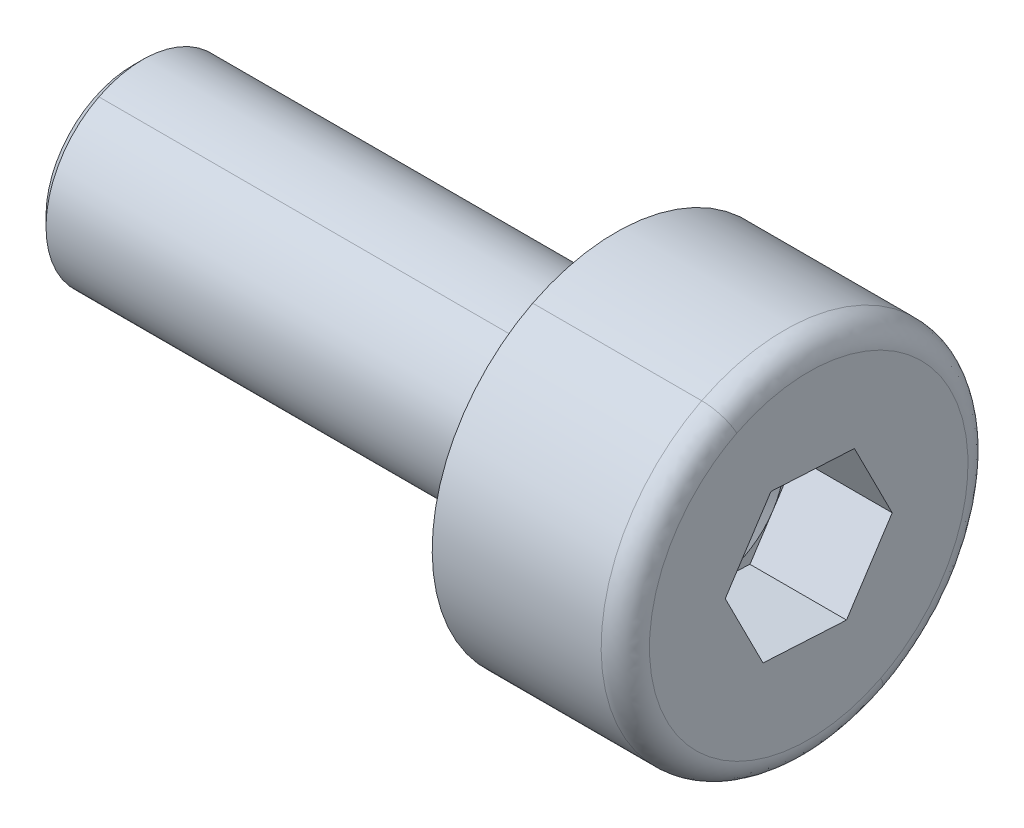
ISO-10303-21;
HEADER;
FILE_DESCRIPTION(('STEP AP214'),'2;1');
FILE_NAME('part.step','',(''),(''),'','','');
FILE_SCHEMA(('AUTOMOTIVE_DESIGN { 1 0 10303 214 1 1 1 1 }'));
ENDSEC;
DATA;
#1=APPLICATION_CONTEXT('core data for automotive mechanical design processes');
#2=APPLICATION_PROTOCOL_DEFINITION('international standard','automotive_design',2000,#1);
#3=PRODUCT_CONTEXT('',#1,'mechanical');
#4=PRODUCT('Part','Part','',(#3));
#5=PRODUCT_RELATED_PRODUCT_CATEGORY('part','',(#4));
#6=PRODUCT_DEFINITION_FORMATION('','',#4);
#7=PRODUCT_DEFINITION_CONTEXT('part definition',#1,'design');
#8=PRODUCT_DEFINITION('design','',#6,#7);
#9=PRODUCT_DEFINITION_SHAPE('','',#8);
#10=(LENGTH_UNIT() NAMED_UNIT(*) SI_UNIT(.MILLI.,.METRE.));
#11=(NAMED_UNIT(*) PLANE_ANGLE_UNIT() SI_UNIT($,.RADIAN.));
#12=(NAMED_UNIT(*) SI_UNIT($,.STERADIAN.) SOLID_ANGLE_UNIT());
#13=UNCERTAINTY_MEASURE_WITH_UNIT(LENGTH_MEASURE(1.E-05),#10,'distance_accuracy_value','');
#14=(GEOMETRIC_REPRESENTATION_CONTEXT(3) GLOBAL_UNCERTAINTY_ASSIGNED_CONTEXT((#13)) GLOBAL_UNIT_ASSIGNED_CONTEXT((#10,
#11,#12)) REPRESENTATION_CONTEXT('',''));
#15=CARTESIAN_POINT('',(0.,0.,0.));
#16=DIRECTION('',(0.,0.,1.));
#17=DIRECTION('',(1.,0.,0.));
#18=AXIS2_PLACEMENT_3D('',#15,#16,#17);
#19=CARTESIAN_POINT('',(31.89999999991,0.,-17.));
#20=DIRECTION('',(1.,0.,0.));
#21=DIRECTION('',(0.,-0.892037641551602,-0.451961111219821));
#22=AXIS2_PLACEMENT_3D('',#19,#20,#21);
#23=CONICAL_SURFACE('',#22,0.749999999698048,1.04719755078461);
#24=DIRECTION('',(0.500000000356795,0.77252725853189,0.391409803745906));
#25=VECTOR('',#24,1.);
#26=CARTESIAN_POINT('',(31.89999999991,0.669028230894353,-16.6610291667216));
#27=LINE('',#26,#25);
#28=CARTESIAN_POINT('',(31.4669872980623,-3.0423578403047E-10,-17.0000000001542));
#29=VERTEX_POINT('',#28);
#30=CARTESIAN_POINT('',(31.9000000000412,0.669028231097183,-16.6610291666189));
#31=VERTEX_POINT('',#30);
#32=EDGE_CURVE('E253',#29,#31,#27,.T.);
#33=ORIENTED_EDGE('',*,*,#32,.F.);
#34=DIRECTION('',(0.500000000356795,-0.77252725853189,-0.391409803745906));
#35=VECTOR('',#34,1.);
#36=CARTESIAN_POINT('',(31.89999999991,-0.669028230894347,-17.3389708332784));
#37=LINE('',#36,#35);
#38=CARTESIAN_POINT('',(31.9000000000412,-0.669028231097177,-17.3389708333812));
#39=VERTEX_POINT('',#38);
#40=EDGE_CURVE('E183',#29,#39,#37,.T.);
#41=ORIENTED_EDGE('',*,*,#40,.T.);
#42=CARTESIAN_POINT('',(31.9000000000412,0.,-17.));
#43=DIRECTION('',(-1.,0.,0.));
#44=DIRECTION('',(0.,-0.892037641551594,-0.451961111219836));
#45=AXIS2_PLACEMENT_3D('',#42,#43,#44);
#46=CIRCLE('',#45,0.749999999925421);
#47=CARTESIAN_POINT('',(31.9000000000206,-0.409910027308919,-17.6280714684299));
#48=VERTEX_POINT('',#47);
#49=EDGE_CURVE('E11',#48,#39,#46,.T.);
#50=ORIENTED_EDGE('',*,*,#49,.F.);
#51=CARTESIAN_POINT('',(31.9000000000412,0.,-17.));
#52=DIRECTION('',(-1.,0.,0.));
#53=DIRECTION('',(0.,-0.892037641551611,-0.451961111219804));
#54=AXIS2_PLACEMENT_3D('',#51,#52,#53);
#55=CIRCLE('',#54,0.749999999925421);
#56=CARTESIAN_POINT('',(31.9000000000206,0.338970833398014,-17.6690282311305));
#57=VERTEX_POINT('',#56);
#58=EDGE_CURVE('E27',#57,#48,#55,.T.);
#59=ORIENTED_EDGE('',*,*,#58,.F.);
#60=CARTESIAN_POINT('',(31.9000000000412,0.,-17.));
#61=DIRECTION('',(-1.,0.,0.));
#62=DIRECTION('',(0.,-0.892037641551602,-0.451961111219822));
#63=AXIS2_PLACEMENT_3D('',#60,#61,#62);
#64=CIRCLE('',#63,0.749999999925422);
#65=CARTESIAN_POINT('',(31.9000000000206,0.748880860706936,-17.0409567627006));
#66=VERTEX_POINT('',#65);
#67=EDGE_CURVE('E239',#66,#57,#64,.T.);
#68=ORIENTED_EDGE('',*,*,#67,.F.);
#69=CARTESIAN_POINT('',(31.9000000000412,0.,-17.));
#70=DIRECTION('',(-1.,0.,0.));
#71=DIRECTION('',(0.,-0.892037641551597,-0.451961111219831));
#72=AXIS2_PLACEMENT_3D('',#69,#70,#71);
#73=CIRCLE('',#72,0.749999999925422);
#74=EDGE_CURVE('E236',#31,#66,#73,.T.);
#75=ORIENTED_EDGE('',*,*,#74,.F.);
#76=EDGE_LOOP('',(#33,#41,#50,#59,#68,#75));
#77=FACE_BOUND('',#76,.T.);
#78=ADVANCED_FACE('F16',(#77),#23,.F.);
#79=CARTESIAN_POINT('',(31.9,-0.677941666829725,-15.6619435376726));
#80=DIRECTION('',(1.,0.,0.));
#81=DIRECTION('',(0.,1.,0.));
#82=AXIS2_PLACEMENT_3D('',#79,#80,#81);
#83=PLANE('',#82);
#84=CARTESIAN_POINT('',(31.9000000000412,0.,-17.));
#85=DIRECTION('',(-1.,0.,0.));
#86=DIRECTION('',(0.,-0.892037641551604,-0.451961111219818));
#87=AXIS2_PLACEMENT_3D('',#84,#85,#86);
#88=CIRCLE('',#87,0.749999999925421);
#89=CARTESIAN_POINT('',(31.9000000000206,-0.74888086070693,-16.9590432372995));
#90=VERTEX_POINT('',#89);
#91=CARTESIAN_POINT('',(31.9000000000206,-0.338970833398008,-16.3309717688696));
#92=VERTEX_POINT('',#91);
#93=EDGE_CURVE('E219',#90,#92,#88,.T.);
#94=ORIENTED_EDGE('',*,*,#93,.T.);
#95=DIRECTION('',(0.,0.892037641551603,0.451961111219819));
#96=VECTOR('',#95,1.);
#97=CARTESIAN_POINT('',(31.9,-0.725234462772684,-16.5266766707558));
#98=LINE('',#97,#96);
#99=CARTESIAN_POINT('',(31.9,-0.725234462772684,-16.5266766707558));
#100=VERTEX_POINT('',#99);
#101=EDGE_CURVE('E42',#100,#92,#98,.T.);
#102=ORIENTED_EDGE('',*,*,#101,.F.);
#103=DIRECTION('',(0.,0.0546090169367945,0.998507814325555));
#104=VECTOR('',#103,1.);
#105=CARTESIAN_POINT('',(31.9,-0.772527258715643,-17.391409803839));
#106=LINE('',#105,#104);
#107=EDGE_CURVE('E195',#90,#100,#106,.T.);
#108=ORIENTED_EDGE('',*,*,#107,.F.);
#109=EDGE_LOOP('',(#94,#102,#108));
#110=FACE_BOUND('',#109,.T.);
#111=ADVANCED_FACE('F364',(#110),#83,.T.);
#112=CARTESIAN_POINT('',(31.9,-0.677941666829725,-15.6619435376726));
#113=DIRECTION('',(1.,0.,0.));
#114=DIRECTION('',(0.,1.,0.));
#115=AXIS2_PLACEMENT_3D('',#112,#113,#114);
#116=PLANE('',#115);
#117=ORIENTED_EDGE('',*,*,#49,.T.);
#118=CARTESIAN_POINT('',(31.9000000000412,0.,-17.));
#119=DIRECTION('',(-1.,0.,0.));
#120=DIRECTION('',(0.,-0.892037641551602,-0.451961111219822));
#121=AXIS2_PLACEMENT_3D('',#118,#119,#120);
#122=CIRCLE('',#121,0.749999999925422);
#123=EDGE_CURVE('E313',#39,#90,#122,.T.);
#124=ORIENTED_EDGE('',*,*,#123,.T.);
#125=DIRECTION('',(0.,0.0546090169367945,0.998507814325555));
#126=VECTOR('',#125,1.);
#127=CARTESIAN_POINT('',(31.9,-0.772527258715643,-17.391409803839));
#128=LINE('',#127,#126);
#129=CARTESIAN_POINT('',(31.9,-0.772527258715643,-17.391409803839));
#130=VERTEX_POINT('',#129);
#131=EDGE_CURVE('E214',#130,#90,#128,.T.);
#132=ORIENTED_EDGE('',*,*,#131,.F.);
#133=DIRECTION('',(0.,-0.837428624614809,0.546546703105736));
#134=VECTOR('',#133,1.);
#135=CARTESIAN_POINT('',(31.9,-0.0472927959429555,-17.8647331330832));
#136=LINE('',#135,#134);
#137=EDGE_CURVE('E210',#48,#130,#136,.T.);
#138=ORIENTED_EDGE('',*,*,#137,.F.);
#139=EDGE_LOOP('',(#117,#124,#132,#138));
#140=FACE_BOUND('',#139,.T.);
#141=ADVANCED_FACE('F18',(#140),#116,.T.);
#142=CARTESIAN_POINT('',(31.9,-0.677941666829725,-15.6619435376726));
#143=DIRECTION('',(1.,0.,0.));
#144=DIRECTION('',(0.,1.,0.));
#145=AXIS2_PLACEMENT_3D('',#142,#143,#144);
#146=PLANE('',#145);
#147=ORIENTED_EDGE('',*,*,#58,.T.);
#148=DIRECTION('',(0.,-0.837428624614809,0.546546703105736));
#149=VECTOR('',#148,1.);
#150=CARTESIAN_POINT('',(31.9,-0.0472927959429555,-17.8647331330832));
#151=LINE('',#150,#149);
#152=CARTESIAN_POINT('',(31.9,-0.0472927959429555,-17.8647331330832));
#153=VERTEX_POINT('',#152);
#154=EDGE_CURVE('E200',#153,#48,#151,.T.);
#155=ORIENTED_EDGE('',*,*,#154,.F.);
#156=DIRECTION('',(0.,-0.892037641551603,-0.451961111219819));
#157=VECTOR('',#156,1.);
#158=CARTESIAN_POINT('',(31.9,0.72523446277269,-17.4733233292442));
#159=LINE('',#158,#157);
#160=EDGE_CURVE('E297',#57,#153,#159,.T.);
#161=ORIENTED_EDGE('',*,*,#160,.F.);
#162=EDGE_LOOP('',(#147,#155,#161));
#163=FACE_BOUND('',#162,.T.);
#164=ADVANCED_FACE('F452',(#163),#146,.T.);
#165=CARTESIAN_POINT('',(31.9,-0.677941666829725,-15.6619435376726));
#166=DIRECTION('',(1.,0.,0.));
#167=DIRECTION('',(0.,1.,0.));
#168=AXIS2_PLACEMENT_3D('',#165,#166,#167);
#169=PLANE('',#168);
#170=ORIENTED_EDGE('',*,*,#67,.T.);
#171=DIRECTION('',(0.,-0.892037641551603,-0.451961111219819));
#172=VECTOR('',#171,1.);
#173=CARTESIAN_POINT('',(31.9,0.72523446277269,-17.4733233292442));
#174=LINE('',#173,#172);
#175=CARTESIAN_POINT('',(31.9,0.72523446277269,-17.4733233292442));
#176=VERTEX_POINT('',#175);
#177=EDGE_CURVE('E235',#176,#57,#174,.T.);
#178=ORIENTED_EDGE('',*,*,#177,.F.);
#179=DIRECTION('',(0.,-0.0546090169367943,-0.998507814325555));
#180=VECTOR('',#179,1.);
#181=CARTESIAN_POINT('',(31.9,0.772527258715648,-16.608590196161));
#182=LINE('',#181,#180);
#183=EDGE_CURVE('E221',#66,#176,#182,.T.);
#184=ORIENTED_EDGE('',*,*,#183,.F.);
#185=EDGE_LOOP('',(#170,#178,#184));
#186=FACE_BOUND('',#185,.T.);
#187=ADVANCED_FACE('F429',(#186),#169,.T.);
#188=CARTESIAN_POINT('',(31.9,-0.677941666829725,-15.6619435376726));
#189=DIRECTION('',(1.,0.,0.));
#190=DIRECTION('',(0.,1.,0.));
#191=AXIS2_PLACEMENT_3D('',#188,#189,#190);
#192=PLANE('',#191);
#193=CARTESIAN_POINT('',(31.9000000000412,0.,-17.));
#194=DIRECTION('',(-1.,0.,0.));
#195=DIRECTION('',(0.,-0.892037641551606,-0.451961111219813));
#196=AXIS2_PLACEMENT_3D('',#193,#194,#195);
#197=CIRCLE('',#196,0.749999999925421);
#198=CARTESIAN_POINT('',(31.9000000000206,0.409910027308925,-16.3719285315701));
#199=VERTEX_POINT('',#198);
#200=EDGE_CURVE('E215',#92,#199,#197,.T.);
#201=ORIENTED_EDGE('',*,*,#200,.T.);
#202=DIRECTION('',(0.,0.837428624614809,-0.546546703105736));
#203=VECTOR('',#202,1.);
#204=CARTESIAN_POINT('',(31.9,0.0472927959429621,-16.1352668669168));
#205=LINE('',#204,#203);
#206=CARTESIAN_POINT('',(31.9,0.0472927959429621,-16.1352668669168));
#207=VERTEX_POINT('',#206);
#208=EDGE_CURVE('E226',#207,#199,#205,.T.);
#209=ORIENTED_EDGE('',*,*,#208,.F.);
#210=DIRECTION('',(0.,0.892037641551603,0.451961111219819));
#211=VECTOR('',#210,1.);
#212=CARTESIAN_POINT('',(31.9,-0.725234462772684,-16.5266766707558));
#213=LINE('',#212,#211);
#214=EDGE_CURVE('E211',#92,#207,#213,.T.);
#215=ORIENTED_EDGE('',*,*,#214,.F.);
#216=EDGE_LOOP('',(#201,#209,#215));
#217=FACE_BOUND('',#216,.T.);
#218=ADVANCED_FACE('F373',(#217),#192,.T.);
#219=CARTESIAN_POINT('',(31.9,-0.677941666829725,-15.6619435376726));
#220=DIRECTION('',(1.,0.,0.));
#221=DIRECTION('',(0.,1.,0.));
#222=AXIS2_PLACEMENT_3D('',#219,#220,#221);
#223=PLANE('',#222);
#224=CARTESIAN_POINT('',(31.9000000000412,0.,-17.));
#225=DIRECTION('',(-1.,0.,0.));
#226=DIRECTION('',(0.,-0.892037641551599,-0.451961111219827));
#227=AXIS2_PLACEMENT_3D('',#224,#225,#226);
#228=CIRCLE('',#227,0.749999999925422);
#229=EDGE_CURVE('E220',#199,#31,#228,.T.);
#230=ORIENTED_EDGE('',*,*,#229,.T.);
#231=ORIENTED_EDGE('',*,*,#74,.T.);
#232=DIRECTION('',(0.,-0.0546090169367943,-0.998507814325555));
#233=VECTOR('',#232,1.);
#234=CARTESIAN_POINT('',(31.9,0.772527258715648,-16.608590196161));
#235=LINE('',#234,#233);
#236=CARTESIAN_POINT('',(31.9,0.772527258715648,-16.608590196161));
#237=VERTEX_POINT('',#236);
#238=EDGE_CURVE('E293',#237,#66,#235,.T.);
#239=ORIENTED_EDGE('',*,*,#238,.F.);
#240=DIRECTION('',(0.,0.837428624614809,-0.546546703105736));
#241=VECTOR('',#240,1.);
#242=CARTESIAN_POINT('',(31.9,0.0472927959429621,-16.1352668669168));
#243=LINE('',#242,#241);
#244=EDGE_CURVE('E179',#199,#237,#243,.T.);
#245=ORIENTED_EDGE('',*,*,#244,.F.);
#246=EDGE_LOOP('',(#230,#231,#239,#245));
#247=FACE_BOUND('',#246,.T.);
#248=ADVANCED_FACE('F440',(#247),#223,.T.);
#249=CARTESIAN_POINT('',(31.9,-0.725234462772684,-16.5266766707558));
#250=DIRECTION('',(0.,0.451961111219819,-0.892037641551603));
#251=DIRECTION('',(-1.,0.,0.));
#252=AXIS2_PLACEMENT_3D('',#249,#250,#251);
#253=PLANE('',#252);
#254=ORIENTED_EDGE('',*,*,#214,.T.);
#255=DIRECTION('',(-1.,0.,0.));
#256=VECTOR('',#255,1.);
#257=CARTESIAN_POINT('',(31.9,0.0472927959429621,-16.1352668669168));
#258=LINE('',#257,#256);
#259=CARTESIAN_POINT('',(32.9,0.0472927959429621,-16.1352668669168));
#260=VERTEX_POINT('',#259);
#261=EDGE_CURVE('E178',#260,#207,#258,.T.);
#262=ORIENTED_EDGE('',*,*,#261,.F.);
#263=DIRECTION('',(0.,-0.892037641551603,-0.451961111219819));
#264=VECTOR('',#263,1.);
#265=CARTESIAN_POINT('',(32.9,-0.338970833414861,-16.3309717688363));
#266=LINE('',#265,#264);
#267=CARTESIAN_POINT('',(32.9,-0.725234462772684,-16.5266766707558));
#268=VERTEX_POINT('',#267);
#269=EDGE_CURVE('E189',#260,#268,#266,.T.);
#270=ORIENTED_EDGE('',*,*,#269,.T.);
#271=DIRECTION('',(1.,0.,0.));
#272=VECTOR('',#271,1.);
#273=CARTESIAN_POINT('',(31.9,-0.725234462772684,-16.5266766707558));
#274=LINE('',#273,#272);
#275=EDGE_CURVE('E199',#100,#268,#274,.T.);
#276=ORIENTED_EDGE('',*,*,#275,.F.);
#277=ORIENTED_EDGE('',*,*,#101,.T.);
#278=EDGE_LOOP('',(#254,#262,#270,#276,#277));
#279=FACE_BOUND('',#278,.T.);
#280=ADVANCED_FACE('F376',(#279),#253,.T.);
#281=CARTESIAN_POINT('',(31.9,-0.772527258715643,-17.391409803839));
#282=DIRECTION('',(0.,0.998507814325555,-0.0546090169367945));
#283=DIRECTION('',(-1.,0.,0.));
#284=AXIS2_PLACEMENT_3D('',#281,#282,#283);
#285=PLANE('',#284);
#286=ORIENTED_EDGE('',*,*,#107,.T.);
#287=ORIENTED_EDGE('',*,*,#275,.T.);
#288=DIRECTION('',(0.,-0.0546090169367944,-0.998507814325555));
#289=VECTOR('',#288,1.);
#290=CARTESIAN_POINT('',(32.9,-0.725234462772684,-16.5266766707558));
#291=LINE('',#290,#289);
#292=CARTESIAN_POINT('',(32.9,-0.772527258715643,-17.391409803839));
#293=VERTEX_POINT('',#292);
#294=EDGE_CURVE('E194',#268,#293,#291,.T.);
#295=ORIENTED_EDGE('',*,*,#294,.T.);
#296=DIRECTION('',(1.,0.,0.));
#297=VECTOR('',#296,1.);
#298=CARTESIAN_POINT('',(31.9,-0.772527258715643,-17.391409803839));
#299=LINE('',#298,#297);
#300=EDGE_CURVE('E207',#130,#293,#299,.T.);
#301=ORIENTED_EDGE('',*,*,#300,.F.);
#302=ORIENTED_EDGE('',*,*,#131,.T.);
#303=EDGE_LOOP('',(#286,#287,#295,#301,#302));
#304=FACE_BOUND('',#303,.T.);
#305=ADVANCED_FACE('F380',(#304),#285,.T.);
#306=CARTESIAN_POINT('',(31.9,-0.0472927959429555,-17.8647331330832));
#307=DIRECTION('',(0.,0.546546703105736,0.837428624614809));
#308=DIRECTION('',(1.,0.,0.));
#309=AXIS2_PLACEMENT_3D('',#306,#307,#308);
#310=PLANE('',#309);
#311=ORIENTED_EDGE('',*,*,#137,.T.);
#312=ORIENTED_EDGE('',*,*,#300,.T.);
#313=DIRECTION('',(0.,0.837428624614809,-0.546546703105735));
#314=VECTOR('',#313,1.);
#315=CARTESIAN_POINT('',(32.9,-0.772527258715643,-17.391409803839));
#316=LINE('',#315,#314);
#317=CARTESIAN_POINT('',(32.9,-0.0472927959429555,-17.8647331330832));
#318=VERTEX_POINT('',#317);
#319=EDGE_CURVE('E320',#293,#318,#316,.T.);
#320=ORIENTED_EDGE('',*,*,#319,.T.);
#321=DIRECTION('',(1.,0.,0.));
#322=VECTOR('',#321,1.);
#323=CARTESIAN_POINT('',(31.9,-0.0472927959429555,-17.8647331330832));
#324=LINE('',#323,#322);
#325=EDGE_CURVE('E301',#153,#318,#324,.T.);
#326=ORIENTED_EDGE('',*,*,#325,.F.);
#327=ORIENTED_EDGE('',*,*,#154,.T.);
#328=EDGE_LOOP('',(#311,#312,#320,#326,#327));
#329=FACE_BOUND('',#328,.T.);
#330=ADVANCED_FACE('F450',(#329),#310,.T.);
#331=CARTESIAN_POINT('',(31.9,0.72523446277269,-17.4733233292442));
#332=DIRECTION('',(0.,-0.451961111219819,0.892037641551603));
#333=DIRECTION('',(-1.,0.,0.));
#334=AXIS2_PLACEMENT_3D('',#331,#332,#333);
#335=PLANE('',#334);
#336=ORIENTED_EDGE('',*,*,#160,.T.);
#337=ORIENTED_EDGE('',*,*,#325,.T.);
#338=DIRECTION('',(0.,0.892037641551603,0.451961111219819));
#339=VECTOR('',#338,1.);
#340=CARTESIAN_POINT('',(32.9,0.338970833414868,-17.6690282311637));
#341=LINE('',#340,#339);
#342=CARTESIAN_POINT('',(32.9,0.72523446277269,-17.4733233292442));
#343=VERTEX_POINT('',#342);
#344=EDGE_CURVE('E205',#318,#343,#341,.T.);
#345=ORIENTED_EDGE('',*,*,#344,.T.);
#346=DIRECTION('',(1.,0.,0.));
#347=VECTOR('',#346,1.);
#348=CARTESIAN_POINT('',(31.9,0.72523446277269,-17.4733233292442));
#349=LINE('',#348,#347);
#350=EDGE_CURVE('E225',#176,#343,#349,.T.);
#351=ORIENTED_EDGE('',*,*,#350,.F.);
#352=ORIENTED_EDGE('',*,*,#177,.T.);
#353=EDGE_LOOP('',(#336,#337,#345,#351,#352));
#354=FACE_BOUND('',#353,.T.);
#355=ADVANCED_FACE('F432',(#354),#335,.T.);
#356=CARTESIAN_POINT('',(31.9,0.772527258715648,-16.608590196161));
#357=DIRECTION('',(0.,-0.998507814325555,0.0546090169367943));
#358=DIRECTION('',(-1.,0.,0.));
#359=AXIS2_PLACEMENT_3D('',#356,#357,#358);
#360=PLANE('',#359);
#361=ORIENTED_EDGE('',*,*,#183,.T.);
#362=ORIENTED_EDGE('',*,*,#350,.T.);
#363=DIRECTION('',(0.,0.0546090169367943,0.998507814325555));
#364=VECTOR('',#363,1.);
#365=CARTESIAN_POINT('',(32.9,0.72523446277269,-17.4733233292442));
#366=LINE('',#365,#364);
#367=CARTESIAN_POINT('',(32.9,0.772527258715648,-16.608590196161));
#368=VERTEX_POINT('',#367);
#369=EDGE_CURVE('E201',#343,#368,#366,.T.);
#370=ORIENTED_EDGE('',*,*,#369,.T.);
#371=DIRECTION('',(1.,0.,0.));
#372=VECTOR('',#371,1.);
#373=CARTESIAN_POINT('',(31.9,0.772527258715648,-16.608590196161));
#374=LINE('',#373,#372);
#375=EDGE_CURVE('E174',#237,#368,#374,.T.);
#376=ORIENTED_EDGE('',*,*,#375,.F.);
#377=ORIENTED_EDGE('',*,*,#238,.T.);
#378=EDGE_LOOP('',(#361,#362,#370,#376,#377));
#379=FACE_BOUND('',#378,.T.);
#380=ADVANCED_FACE('F436',(#379),#360,.T.);
#381=CARTESIAN_POINT('',(31.9,0.0472927959429621,-16.1352668669168));
#382=DIRECTION('',(0.,-0.546546703105736,-0.837428624614809));
#383=DIRECTION('',(0.,-0.837428624614809,0.546546703105736));
#384=AXIS2_PLACEMENT_3D('',#381,#382,#383);
#385=PLANE('',#384);
#386=ORIENTED_EDGE('',*,*,#244,.T.);
#387=ORIENTED_EDGE('',*,*,#375,.T.);
#388=DIRECTION('',(0.,-0.837428624614809,0.546546703105736));
#389=VECTOR('',#388,1.);
#390=CARTESIAN_POINT('',(32.9,0.772527258715648,-16.608590196161));
#391=LINE('',#390,#389);
#392=EDGE_CURVE('E193',#368,#260,#391,.T.);
#393=ORIENTED_EDGE('',*,*,#392,.T.);
#394=ORIENTED_EDGE('',*,*,#261,.T.);
#395=ORIENTED_EDGE('',*,*,#208,.T.);
#396=EDGE_LOOP('',(#386,#387,#393,#394,#395));
#397=FACE_BOUND('',#396,.T.);
#398=ADVANCED_FACE('F442',(#397),#385,.T.);
#399=CARTESIAN_POINT('',(32.9,0.,-17.));
#400=DIRECTION('',(-1.,0.,0.));
#401=DIRECTION('',(0.,0.,1.));
#402=AXIS2_PLACEMENT_3D('',#399,#400,#401);
#403=PLANE('',#402);
#404=ORIENTED_EDGE('',*,*,#369,.F.);
#405=ORIENTED_EDGE('',*,*,#344,.F.);
#406=ORIENTED_EDGE('',*,*,#319,.F.);
#407=ORIENTED_EDGE('',*,*,#294,.F.);
#408=ORIENTED_EDGE('',*,*,#269,.F.);
#409=ORIENTED_EDGE('',*,*,#392,.F.);
#410=EDGE_LOOP('',(#404,#405,#406,#407,#408,#409));
#411=FACE_BOUND('',#410,.T.);
#412=CARTESIAN_POINT('',(32.9,1.47186210856015,-16.2542641664873));
#413=CARTESIAN_POINT('',(32.9,2.96333377558555,-19.1979883836076));
#414=CARTESIAN_POINT('',(32.9,0.0196095584652598,-20.689460050633));
#415=CARTESIAN_POINT('',(32.9,-1.47186210856014,-17.7457358335127));
#416=(BOUNDED_CURVE() B_SPLINE_CURVE(3,(#412,#413,#414,#415),.UNSPECIFIED.,.F.,
.F.) B_SPLINE_CURVE_WITH_KNOTS((4,4),(0.,1.),
.UNSPECIFIED.) CURVE() GEOMETRIC_REPRESENTATION_ITEM() RATIONAL_B_SPLINE_CURVE((1.,
0.333333333333334,0.333333333333334,1.)) REPRESENTATION_ITEM(''));
#417=CARTESIAN_POINT('',(32.9,1.47186210856015,-16.2542641664873));
#418=VERTEX_POINT('',#417);
#419=CARTESIAN_POINT('',(32.9,-1.47186210856014,-17.7457358335127));
#420=VERTEX_POINT('',#419);
#421=EDGE_CURVE('E206',#418,#420,#416,.T.);
#422=ORIENTED_EDGE('',*,*,#421,.F.);
#423=CARTESIAN_POINT('',(32.9,-1.47186210856014,-17.7457358335127));
#424=CARTESIAN_POINT('',(32.9,-2.96333377558554,-14.8020116163924));
#425=CARTESIAN_POINT('',(32.9,-0.0196095584652533,-13.310539949367));
#426=CARTESIAN_POINT('',(32.9,1.47186210856015,-16.2542641664873));
#427=(BOUNDED_CURVE() B_SPLINE_CURVE(3,(#423,#424,#425,#426),.UNSPECIFIED.,.F.,
.F.) B_SPLINE_CURVE_WITH_KNOTS((4,4),(0.,1.),
.UNSPECIFIED.) CURVE() GEOMETRIC_REPRESENTATION_ITEM() RATIONAL_B_SPLINE_CURVE((1.,
0.333333333333334,0.333333333333334,1.)) REPRESENTATION_ITEM(''));
#428=EDGE_CURVE('E244',#420,#418,#427,.T.);
#429=ORIENTED_EDGE('',*,*,#428,.F.);
#430=EDGE_LOOP('',(#422,#429));
#431=FACE_BOUND('',#430,.T.);
#432=ADVANCED_FACE('F445',(#411,#431),#403,.F.);
#433=CARTESIAN_POINT('',(32.65,1.69487151894805,-16.1412738886824));
#434=CARTESIAN_POINT('',(32.6499999999999,3.41232374158336,-19.5310169265784));
#435=CARTESIAN_POINT('',(32.6499999999999,0.0225807036872713,-21.2484691492137));
#436=CARTESIAN_POINT('',(32.65,-1.69487151894804,-17.8587261113177));
#437=CARTESIAN_POINT('',(32.7964466094068,1.69487151894805,-16.1412738886823));
#438=CARTESIAN_POINT('',(32.7964466094067,3.41232374158336,-19.5310169265784));
#439=CARTESIAN_POINT('',(32.7964466094067,0.0225807036872713,-21.2484691492137));
#440=CARTESIAN_POINT('',(32.7964466094068,-1.69487151894804,-17.8587261113177));
#441=CARTESIAN_POINT('',(32.9,1.60249799662855,-16.1880759941655));
#442=CARTESIAN_POINT('',(32.9,3.22634600829763,-19.3930719874225));
#443=CARTESIAN_POINT('',(32.9,0.0213500150405324,-21.0169199990916));
#444=CARTESIAN_POINT('',(32.9,-1.60249799662855,-17.8119240058345));
#445=CARTESIAN_POINT('',(32.9,1.47186210856015,-16.2542641664873));
#446=CARTESIAN_POINT('',(32.9,2.96333377558555,-19.1979883836076));
#447=CARTESIAN_POINT('',(32.9,0.0196095584652591,-20.689460050633));
#448=CARTESIAN_POINT('',(32.9,-1.47186210856014,-17.7457358335127));
#449=(BOUNDED_SURFACE() B_SPLINE_SURFACE(3,3,((#433,#434,#435,#436),(#437,#438,#439,#440),(#441,
#442,#443,#444),(#445,#446,#447,#448)),.UNSPECIFIED.,.F.,.F.,
.F.) B_SPLINE_SURFACE_WITH_KNOTS((4,4),(4,4),(0.,1.),(0.,1.),
.UNSPECIFIED.) GEOMETRIC_REPRESENTATION_ITEM() RATIONAL_B_SPLINE_SURFACE(((1.,0.333333333333334,
0.333333333333334,1.),(0.804737854124365,0.268245951374788,0.268245951374788,0.804737854124365),
(0.804737854124365,0.268245951374788,0.268245951374788,0.804737854124365),(1.,0.333333333333334,
0.333333333333334,1.))) REPRESENTATION_ITEM('') SURFACE());
#450=CARTESIAN_POINT('',(32.65,-1.47186210856014,-17.7457358335127));
#451=DIRECTION('',(0.,-0.451961111219825,0.8920376415516));
#452=DIRECTION('',(0.,-0.8920376415516,-0.451961111219825));
#453=AXIS2_PLACEMENT_3D('',#450,#451,#452);
#454=CIRCLE('',#453,0.25);
#455=CARTESIAN_POINT('',(32.65,-1.69487151894804,-17.8587261113177));
#456=VERTEX_POINT('',#455);
#457=EDGE_CURVE('E188',#456,#420,#454,.T.);
#458=CARTESIAN_POINT('',(32.65,0.,-17.));
#459=DIRECTION('',(-1.,0.,0.));
#460=DIRECTION('',(0.,-0.892037641551603,-0.45196111121982));
#461=AXIS2_PLACEMENT_3D('',#458,#459,#460);
#462=CIRCLE('',#461,1.9);
#463=CARTESIAN_POINT('',(32.65,1.69487151894805,-16.1412738886824));
#464=VERTEX_POINT('',#463);
#465=EDGE_CURVE('E184',#464,#456,#462,.T.);
#466=CARTESIAN_POINT('',(32.65,1.47186210856015,-16.2542641664873));
#467=DIRECTION('',(0.,0.451961111219825,-0.8920376415516));
#468=DIRECTION('',(0.,0.8920376415516,0.451961111219825));
#469=AXIS2_PLACEMENT_3D('',#466,#467,#468);
#470=CIRCLE('',#469,0.25);
#471=EDGE_CURVE('E247',#464,#418,#470,.T.);
#472=ORIENTED_EDGE('',*,*,#457,.F.);
#473=ORIENTED_EDGE('',*,*,#465,.F.);
#474=ORIENTED_EDGE('',*,*,#471,.T.);
#475=ORIENTED_EDGE('',*,*,#421,.T.);
#476=EDGE_LOOP('',(#472,#473,#474,#475));
#477=FACE_BOUND('',#476,.T.);
#478=ADVANCED_FACE('F732',(#477),#449,.T.);
#479=CARTESIAN_POINT('',(25.9,0.,-17.));
#480=DIRECTION('',(-1.,0.,0.));
#481=DIRECTION('',(0.,0.,1.));
#482=AXIS2_PLACEMENT_3D('',#479,#480,#481);
#483=PLANE('',#482);
#484=CARTESIAN_POINT('',(25.899999999995,0.,-17.));
#485=DIRECTION('',(1.,0.,0.));
#486=DIRECTION('',(0.,-0.45196111121982,0.892037641551603));
#487=AXIS2_PLACEMENT_3D('',#484,#485,#486);
#488=CIRCLE('',#487,0.900000000058298);
#489=CARTESIAN_POINT('',(25.899999999995,-0.406765000124183,-16.1971661225515));
#490=VERTEX_POINT('',#489);
#491=CARTESIAN_POINT('',(25.899999999995,0.406765000124189,-17.8028338774484));
#492=VERTEX_POINT('',#491);
#493=EDGE_CURVE('E248',#490,#492,#488,.T.);
#494=ORIENTED_EDGE('',*,*,#493,.F.);
#495=CARTESIAN_POINT('',(25.899999999995,0.,-17.));
#496=DIRECTION('',(1.,0.,0.));
#497=DIRECTION('',(0.,-0.45196111121982,0.892037641551603));
#498=AXIS2_PLACEMENT_3D('',#495,#496,#497);
#499=CIRCLE('',#498,0.900000000058298);
#500=EDGE_CURVE('E264',#492,#490,#499,.T.);
#501=ORIENTED_EDGE('',*,*,#500,.F.);
#502=EDGE_LOOP('',(#494,#501));
#503=FACE_BOUND('',#502,.T.);
#504=ADVANCED_FACE('F736',(#503),#483,.T.);
#505=CARTESIAN_POINT('',(30.9,0.,-17.));
#506=DIRECTION('',(1.,0.,0.));
#507=DIRECTION('',(0.,-0.892037641551603,-0.45196111121982));
#508=AXIS2_PLACEMENT_3D('',#505,#506,#507);
#509=CYLINDRICAL_SURFACE('',#508,1.9);
#510=DIRECTION('',(1.,0.,0.));
#511=VECTOR('',#510,1.);
#512=CARTESIAN_POINT('',(30.9,1.69487151894805,-16.1412738886824));
#513=LINE('',#512,#511);
#514=CARTESIAN_POINT('',(30.9,1.69487151894805,-16.1412738886824));
#515=VERTEX_POINT('',#514);
#516=EDGE_CURVE('E263',#515,#464,#513,.T.);
#517=ORIENTED_EDGE('',*,*,#516,.F.);
#518=CARTESIAN_POINT('',(30.9,0.,-17.));
#519=DIRECTION('',(-1.,0.,0.));
#520=DIRECTION('',(0.,-0.892037641551603,-0.45196111121982));
#521=AXIS2_PLACEMENT_3D('',#518,#519,#520);
#522=CIRCLE('',#521,1.9);
#523=CARTESIAN_POINT('',(30.9,-1.69487151894804,-17.8587261113177));
#524=VERTEX_POINT('',#523);
#525=EDGE_CURVE('E146',#524,#515,#522,.T.);
#526=ORIENTED_EDGE('',*,*,#525,.F.);
#527=DIRECTION('',(1.,0.,0.));
#528=VECTOR('',#527,1.);
#529=CARTESIAN_POINT('',(30.9,-1.69487151894804,-17.8587261113177));
#530=LINE('',#529,#528);
#531=EDGE_CURVE('E180',#524,#456,#530,.T.);
#532=ORIENTED_EDGE('',*,*,#531,.T.);
#533=CARTESIAN_POINT('',(32.65,0.,-17.));
#534=DIRECTION('',(-1.,0.,0.));
#535=DIRECTION('',(0.,-0.892037641551603,-0.45196111121982));
#536=AXIS2_PLACEMENT_3D('',#533,#534,#535);
#537=CIRCLE('',#536,1.9);
#538=EDGE_CURVE('E185',#456,#464,#537,.T.);
#539=ORIENTED_EDGE('',*,*,#538,.T.);
#540=EDGE_LOOP('',(#517,#526,#532,#539));
#541=FACE_BOUND('',#540,.T.);
#542=ADVANCED_FACE('F768',(#541),#509,.T.);
#543=CARTESIAN_POINT('',(25.9999999999699,0.,-17.));
#544=DIRECTION('',(1.,0.,0.));
#545=DIRECTION('',(0.,-0.451961111219819,0.892037641551603));
#546=AXIS2_PLACEMENT_3D('',#543,#544,#545);
#547=CONICAL_SURFACE('',#546,1.0000000000332,0.785398163397448);
#548=DIRECTION('',(0.707106781186548,0.319584766576141,-0.630765865414793));
#549=VECTOR('',#548,1.);
#550=CARTESIAN_POINT('',(25.9999999999699,0.451961111234826,-17.8920376415812));
#551=LINE('',#550,#549);
#552=CARTESIAN_POINT('',(26.,0.451961111248432,-17.8920376416081));
#553=VERTEX_POINT('',#552);
#554=EDGE_CURVE('E252',#492,#553,#551,.T.);
#555=ORIENTED_EDGE('',*,*,#554,.F.);
#556=ORIENTED_EDGE('',*,*,#500,.T.);
#557=DIRECTION('',(0.707106781186547,-0.319584766576142,0.630765865414794));
#558=VECTOR('',#557,1.);
#559=CARTESIAN_POINT('',(25.9999999999699,-0.45196111123482,-16.1079623584188));
#560=LINE('',#559,#558);
#561=CARTESIAN_POINT('',(26.,-0.451961111248426,-16.107962358392));
#562=VERTEX_POINT('',#561);
#563=EDGE_CURVE('E286',#490,#562,#560,.T.);
#564=ORIENTED_EDGE('',*,*,#563,.T.);
#565=CARTESIAN_POINT('',(26.,0.,-17.));
#566=DIRECTION('',(1.,0.,0.));
#567=DIRECTION('',(0.,-0.892037641551603,-0.451961111219819));
#568=AXIS2_PLACEMENT_3D('',#565,#566,#567);
#569=CIRCLE('',#568,1.);
#570=CARTESIAN_POINT('',(26.,0.892037641551606,-16.5480388887802));
#571=VERTEX_POINT('',#570);
#572=EDGE_CURVE('E147',#571,#562,#569,.T.);
#573=ORIENTED_EDGE('',*,*,#572,.F.);
#574=CARTESIAN_POINT('',(26.,0.,-17.));
#575=DIRECTION('',(1.,0.,0.));
#576=DIRECTION('',(0.,-0.892037641551603,-0.451961111219819));
#577=AXIS2_PLACEMENT_3D('',#574,#575,#576);
#578=CIRCLE('',#577,1.);
#579=EDGE_CURVE('E169',#553,#571,#578,.T.);
#580=ORIENTED_EDGE('',*,*,#579,.F.);
#581=EDGE_LOOP('',(#555,#556,#564,#573,#580));
#582=FACE_BOUND('',#581,.T.);
#583=ADVANCED_FACE('F800',(#582),#547,.T.);
#584=CARTESIAN_POINT('',(30.9,0.,-17.));
#585=DIRECTION('',(-1.,0.,0.));
#586=DIRECTION('',(0.,0.,1.));
#587=AXIS2_PLACEMENT_3D('',#584,#585,#586);
#588=PLANE('',#587);
#589=CARTESIAN_POINT('',(30.9,0.,-17.));
#590=DIRECTION('',(-1.,0.,0.));
#591=DIRECTION('',(0.,-0.892037641551603,-0.451961111219819));
#592=AXIS2_PLACEMENT_3D('',#589,#590,#591);
#593=CIRCLE('',#592,1.);
#594=CARTESIAN_POINT('',(30.9,-0.8920376415516,-17.4519611112198));
#595=VERTEX_POINT('',#594);
#596=CARTESIAN_POINT('',(30.9,0.892037641551606,-16.5480388887802));
#597=VERTEX_POINT('',#596);
#598=EDGE_CURVE('E136',#595,#597,#593,.T.);
#599=ORIENTED_EDGE('',*,*,#598,.F.);
#600=CARTESIAN_POINT('',(30.9,0.,-17.));
#601=DIRECTION('',(-1.,0.,0.));
#602=DIRECTION('',(0.,-0.892037641551603,-0.451961111219819));
#603=AXIS2_PLACEMENT_3D('',#600,#601,#602);
#604=CIRCLE('',#603,1.);
#605=EDGE_CURVE('E141',#597,#595,#604,.T.);
#606=ORIENTED_EDGE('',*,*,#605,.F.);
#607=EDGE_LOOP('',(#599,#606));
#608=FACE_BOUND('',#607,.T.);
#609=ORIENTED_EDGE('',*,*,#525,.T.);
#610=CARTESIAN_POINT('',(30.9,0.,-17.));
#611=DIRECTION('',(-1.,0.,0.));
#612=DIRECTION('',(0.,-0.892037641551603,-0.45196111121982));
#613=AXIS2_PLACEMENT_3D('',#610,#611,#612);
#614=CIRCLE('',#613,1.9);
#615=EDGE_CURVE('E282',#515,#524,#614,.T.);
#616=ORIENTED_EDGE('',*,*,#615,.T.);
#617=EDGE_LOOP('',(#609,#616));
#618=FACE_BOUND('',#617,.T.);
#619=ADVANCED_FACE('F138',(#608,#618),#588,.T.);
#620=CARTESIAN_POINT('',(25.9,0.,-17.));
#621=DIRECTION('',(1.,0.,0.));
#622=DIRECTION('',(0.,-0.892037641551603,-0.451961111219819));
#623=AXIS2_PLACEMENT_3D('',#620,#621,#622);
#624=CYLINDRICAL_SURFACE('',#623,1.);
#625=DIRECTION('',(1.,0.,0.));
#626=VECTOR('',#625,1.);
#627=CARTESIAN_POINT('',(25.9,0.892037641551606,-16.5480388887802));
#628=LINE('',#627,#626);
#629=EDGE_CURVE('E161',#571,#597,#628,.T.);
#630=ORIENTED_EDGE('',*,*,#629,.F.);
#631=ORIENTED_EDGE('',*,*,#572,.T.);
#632=CARTESIAN_POINT('',(26.,0.,-17.));
#633=DIRECTION('',(1.,0.,0.));
#634=DIRECTION('',(0.,-0.892037641551603,-0.451961111219819));
#635=AXIS2_PLACEMENT_3D('',#632,#633,#634);
#636=CIRCLE('',#635,1.);
#637=CARTESIAN_POINT('',(26.,-0.8920376415516,-17.4519611112198));
#638=VERTEX_POINT('',#637);
#639=EDGE_CURVE('E153',#562,#638,#636,.T.);
#640=ORIENTED_EDGE('',*,*,#639,.T.);
#641=DIRECTION('',(1.,0.,0.));
#642=VECTOR('',#641,1.);
#643=CARTESIAN_POINT('',(25.9,-0.8920376415516,-17.4519611112198));
#644=LINE('',#643,#642);
#645=EDGE_CURVE('E150',#638,#595,#644,.T.);
#646=ORIENTED_EDGE('',*,*,#645,.T.);
#647=ORIENTED_EDGE('',*,*,#598,.T.);
#648=EDGE_LOOP('',(#630,#631,#640,#646,#647));
#649=FACE_BOUND('',#648,.T.);
#650=ADVANCED_FACE('F151',(#649),#624,.T.);
#651=CARTESIAN_POINT('',(31.89999999991,0.,-17.));
#652=DIRECTION('',(1.,0.,0.));
#653=DIRECTION('',(0.,-0.892037641551602,-0.451961111219821));
#654=AXIS2_PLACEMENT_3D('',#651,#652,#653);
#655=CONICAL_SURFACE('',#654,0.749999999698048,1.04719755078461);
#656=ORIENTED_EDGE('',*,*,#40,.F.);
#657=ORIENTED_EDGE('',*,*,#32,.T.);
#658=ORIENTED_EDGE('',*,*,#229,.F.);
#659=ORIENTED_EDGE('',*,*,#200,.F.);
#660=ORIENTED_EDGE('',*,*,#93,.F.);
#661=ORIENTED_EDGE('',*,*,#123,.F.);
#662=EDGE_LOOP('',(#656,#657,#658,#659,#660,#661));
#663=FACE_BOUND('',#662,.T.);
#664=ADVANCED_FACE('F369',(#663),#655,.F.);
#665=CARTESIAN_POINT('',(30.9,0.,-17.));
#666=DIRECTION('',(1.,0.,0.));
#667=DIRECTION('',(0.,-0.892037641551603,-0.45196111121982));
#668=AXIS2_PLACEMENT_3D('',#665,#666,#667);
#669=CYLINDRICAL_SURFACE('',#668,1.9);
#670=ORIENTED_EDGE('',*,*,#615,.F.);
#671=ORIENTED_EDGE('',*,*,#516,.T.);
#672=ORIENTED_EDGE('',*,*,#465,.T.);
#673=ORIENTED_EDGE('',*,*,#531,.F.);
#674=EDGE_LOOP('',(#670,#671,#672,#673));
#675=FACE_BOUND('',#674,.T.);
#676=ADVANCED_FACE('F700',(#675),#669,.T.);
#677=CARTESIAN_POINT('',(25.9999999999699,0.,-17.));
#678=DIRECTION('',(1.,0.,0.));
#679=DIRECTION('',(0.,-0.451961111219819,0.892037641551603));
#680=AXIS2_PLACEMENT_3D('',#677,#678,#679);
#681=CONICAL_SURFACE('',#680,1.0000000000332,0.785398163397448);
#682=ORIENTED_EDGE('',*,*,#493,.T.);
#683=ORIENTED_EDGE('',*,*,#554,.T.);
#684=CARTESIAN_POINT('',(26.,0.,-17.));
#685=DIRECTION('',(1.,0.,0.));
#686=DIRECTION('',(0.,-0.892037641551603,-0.451961111219819));
#687=AXIS2_PLACEMENT_3D('',#684,#685,#686);
#688=CIRCLE('',#687,1.);
#689=EDGE_CURVE('E20',#638,#553,#688,.T.);
#690=ORIENTED_EDGE('',*,*,#689,.F.);
#691=ORIENTED_EDGE('',*,*,#639,.F.);
#692=ORIENTED_EDGE('',*,*,#563,.F.);
#693=EDGE_LOOP('',(#682,#683,#690,#691,#692));
#694=FACE_BOUND('',#693,.T.);
#695=ADVANCED_FACE('F696',(#694),#681,.T.);
#696=CARTESIAN_POINT('',(25.9,0.,-17.));
#697=DIRECTION('',(1.,0.,0.));
#698=DIRECTION('',(0.,-0.892037641551603,-0.451961111219819));
#699=AXIS2_PLACEMENT_3D('',#696,#697,#698);
#700=CYLINDRICAL_SURFACE('',#699,1.);
#701=ORIENTED_EDGE('',*,*,#579,.T.);
#702=ORIENTED_EDGE('',*,*,#629,.T.);
#703=ORIENTED_EDGE('',*,*,#605,.T.);
#704=ORIENTED_EDGE('',*,*,#645,.F.);
#705=ORIENTED_EDGE('',*,*,#689,.T.);
#706=EDGE_LOOP('',(#701,#702,#703,#704,#705));
#707=FACE_BOUND('',#706,.T.);
#708=ADVANCED_FACE('F160',(#707),#700,.T.);
#709=CARTESIAN_POINT('',(32.65,-1.69487151894804,-17.8587261113177));
#710=CARTESIAN_POINT('',(32.6499999999999,-3.41232374158335,-14.4689830734216));
#711=CARTESIAN_POINT('',(32.6499999999999,-0.0225807036872652,-12.7515308507863));
#712=CARTESIAN_POINT('',(32.65,1.69487151894805,-16.1412738886824));
#713=CARTESIAN_POINT('',(32.7964466094068,-1.69487151894804,-17.8587261113177));
#714=CARTESIAN_POINT('',(32.7964466094067,-3.41232374158336,-14.4689830734216));
#715=CARTESIAN_POINT('',(32.7964466094067,-0.0225807036872653,-12.7515308507863));
#716=CARTESIAN_POINT('',(32.7964466094068,1.69487151894805,-16.1412738886823));
#717=CARTESIAN_POINT('',(32.9,-1.60249799662855,-17.8119240058346));
#718=CARTESIAN_POINT('',(32.9,-3.22634600829763,-14.6069280125774));
#719=CARTESIAN_POINT('',(32.9,-0.0213500150405266,-12.9830800009084));
#720=CARTESIAN_POINT('',(32.9,1.60249799662855,-16.1880759941655));
#721=CARTESIAN_POINT('',(32.9,-1.47186210856014,-17.7457358335127));
#722=CARTESIAN_POINT('',(32.9,-2.96333377558554,-14.8020116163924));
#723=CARTESIAN_POINT('',(32.9,-0.0196095584652528,-13.310539949367));
#724=CARTESIAN_POINT('',(32.9,1.47186210856015,-16.2542641664873));
#725=(BOUNDED_SURFACE() B_SPLINE_SURFACE(3,3,((#709,#710,#711,#712),(#713,#714,#715,#716),(#717,
#718,#719,#720),(#721,#722,#723,#724)),.UNSPECIFIED.,.F.,.F.,
.F.) B_SPLINE_SURFACE_WITH_KNOTS((4,4),(4,4),(0.,1.),(0.,1.),
.UNSPECIFIED.) GEOMETRIC_REPRESENTATION_ITEM() RATIONAL_B_SPLINE_SURFACE(((1.,0.333333333333334,
0.333333333333334,1.),(0.804737854124365,0.268245951374788,0.268245951374788,0.804737854124365),
(0.804737854124365,0.268245951374788,0.268245951374788,0.804737854124365),(1.,0.333333333333334,
0.333333333333334,1.))) REPRESENTATION_ITEM('') SURFACE());
#726=ORIENTED_EDGE('',*,*,#538,.F.);
#727=ORIENTED_EDGE('',*,*,#457,.T.);
#728=ORIENTED_EDGE('',*,*,#428,.T.);
#729=ORIENTED_EDGE('',*,*,#471,.F.);
#730=EDGE_LOOP('',(#726,#727,#728,#729));
#731=FACE_BOUND('',#730,.T.);
#732=ADVANCED_FACE('F709',(#731),#725,.T.);
#733=CLOSED_SHELL('',(#78,#111,#141,#164,#187,#218,#248,#280,#305,#330,#355,#380,#398,#432,#478,
#504,#542,#583,#619,#650,#664,#676,#695,#708,#732));
#734=MANIFOLD_SOLID_BREP('B1',#733);
#735=ADVANCED_BREP_SHAPE_REPRESENTATION('',(#18,#734),#14);
#736=SHAPE_DEFINITION_REPRESENTATION(#9,#735);
ENDSEC;
END-ISO-10303-21;
